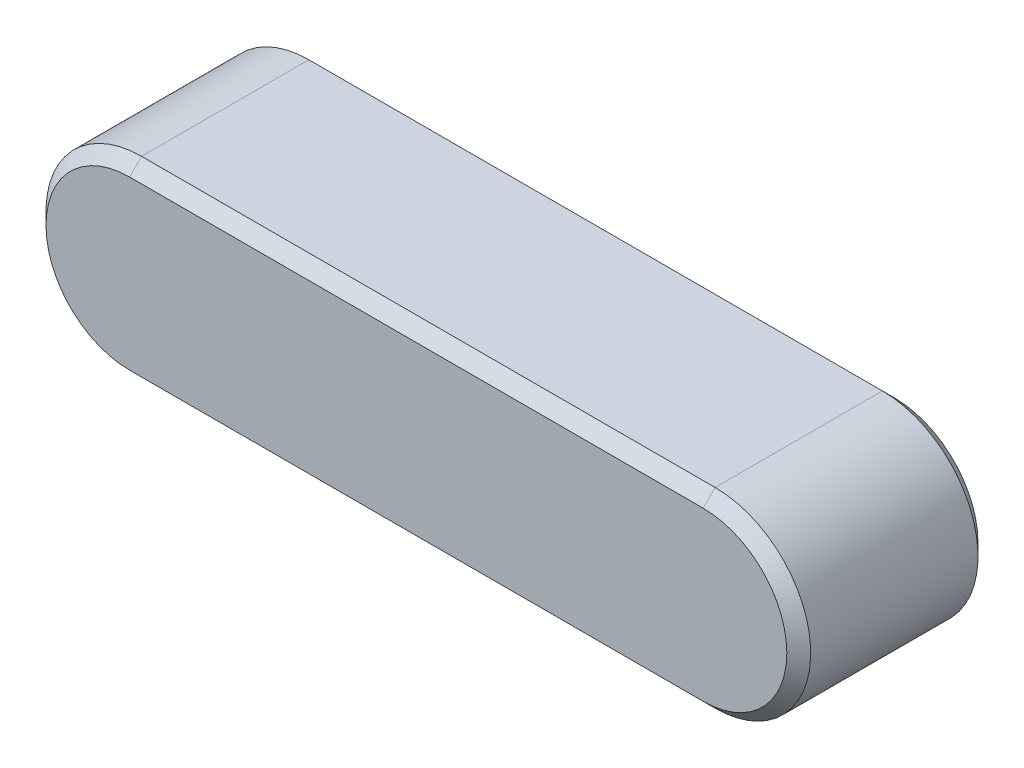
ISO-10303-21;
HEADER;
FILE_DESCRIPTION(('STEP AP214'),'2;1');
FILE_NAME('part.step','',(''),(''),'','','');
FILE_SCHEMA(('AUTOMOTIVE_DESIGN { 1 0 10303 214 1 1 1 1 }'));
ENDSEC;
DATA;
#1=APPLICATION_CONTEXT('core data for automotive mechanical design processes');
#2=APPLICATION_PROTOCOL_DEFINITION('international standard','automotive_design',2000,#1);
#3=PRODUCT_CONTEXT('',#1,'mechanical');
#4=PRODUCT('Part','Part','',(#3));
#5=PRODUCT_RELATED_PRODUCT_CATEGORY('part','',(#4));
#6=PRODUCT_DEFINITION_FORMATION('','',#4);
#7=PRODUCT_DEFINITION_CONTEXT('part definition',#1,'design');
#8=PRODUCT_DEFINITION('design','',#6,#7);
#9=PRODUCT_DEFINITION_SHAPE('','',#8);
#10=(LENGTH_UNIT() NAMED_UNIT(*) SI_UNIT(.MILLI.,.METRE.));
#11=(NAMED_UNIT(*) PLANE_ANGLE_UNIT() SI_UNIT($,.RADIAN.));
#12=(NAMED_UNIT(*) SI_UNIT($,.STERADIAN.) SOLID_ANGLE_UNIT());
#13=UNCERTAINTY_MEASURE_WITH_UNIT(LENGTH_MEASURE(1.E-05),#10,'distance_accuracy_value','');
#14=(GEOMETRIC_REPRESENTATION_CONTEXT(3) GLOBAL_UNCERTAINTY_ASSIGNED_CONTEXT((#13)) GLOBAL_UNIT_ASSIGNED_CONTEXT((#10,
#11,#12)) REPRESENTATION_CONTEXT('',''));
#15=CARTESIAN_POINT('',(0.,0.,0.));
#16=DIRECTION('',(0.,0.,1.));
#17=DIRECTION('',(1.,0.,0.));
#18=AXIS2_PLACEMENT_3D('',#15,#16,#17);
#19=CARTESIAN_POINT('',(-12.,0.,2.));
#20=DIRECTION('',(0.,0.,-1.));
#21=DIRECTION('',(-1.,0.,0.));
#22=AXIS2_PLACEMENT_3D('',#19,#20,#21);
#23=CYLINDRICAL_SURFACE('',#22,2.);
#24=DIRECTION('',(0.,0.,-1.));
#25=VECTOR('',#24,1.);
#26=CARTESIAN_POINT('',(-12.,-2.,2.));
#27=LINE('',#26,#25);
#28=CARTESIAN_POINT('',(-12.,-2.,1.75));
#29=VERTEX_POINT('',#28);
#30=CARTESIAN_POINT('',(-12.,-2.,-1.75));
#31=VERTEX_POINT('',#30);
#32=EDGE_CURVE('E120',#29,#31,#27,.T.);
#33=ORIENTED_EDGE('',*,*,#32,.F.);
#34=CARTESIAN_POINT('',(-12.,0.,1.75));
#35=DIRECTION('',(0.,0.,-1.));
#36=DIRECTION('',(-1.,0.,0.));
#37=AXIS2_PLACEMENT_3D('',#34,#35,#36);
#38=CIRCLE('',#37,2.);
#39=CARTESIAN_POINT('',(-12.,2.,1.75));
#40=VERTEX_POINT('',#39);
#41=EDGE_CURVE('E54',#29,#40,#38,.T.);
#42=ORIENTED_EDGE('',*,*,#41,.T.);
#43=DIRECTION('',(0.,0.,-1.));
#44=VECTOR('',#43,1.);
#45=CARTESIAN_POINT('',(-12.,2.,2.));
#46=LINE('',#45,#44);
#47=CARTESIAN_POINT('',(-12.,2.,-1.75));
#48=VERTEX_POINT('',#47);
#49=EDGE_CURVE('E158',#40,#48,#46,.T.);
#50=ORIENTED_EDGE('',*,*,#49,.T.);
#51=CARTESIAN_POINT('',(-12.,0.,-1.75));
#52=DIRECTION('',(0.,0.,-1.));
#53=DIRECTION('',(-1.,0.,0.));
#54=AXIS2_PLACEMENT_3D('',#51,#52,#53);
#55=CIRCLE('',#54,2.);
#56=EDGE_CURVE('E108',#48,#31,#55,.F.);
#57=ORIENTED_EDGE('',*,*,#56,.T.);
#58=EDGE_LOOP('',(#33,#42,#50,#57));
#59=FACE_BOUND('',#58,.T.);
#60=ADVANCED_FACE('F31',(#59),#23,.T.);
#61=CARTESIAN_POINT('',(0.,-2.,2.));
#62=DIRECTION('',(0.,1.,0.));
#63=DIRECTION('',(-1.,0.,0.));
#64=AXIS2_PLACEMENT_3D('',#61,#62,#63);
#65=PLANE('',#64);
#66=ORIENTED_EDGE('',*,*,#32,.T.);
#67=DIRECTION('',(1.,0.,0.));
#68=VECTOR('',#67,1.);
#69=CARTESIAN_POINT('',(0.,-2.,-1.75));
#70=LINE('',#69,#68);
#71=CARTESIAN_POINT('',(0.,-2.,-1.75));
#72=VERTEX_POINT('',#71);
#73=EDGE_CURVE('E119',#31,#72,#70,.T.);
#74=ORIENTED_EDGE('',*,*,#73,.T.);
#75=DIRECTION('',(0.,0.,-1.));
#76=VECTOR('',#75,1.);
#77=CARTESIAN_POINT('',(0.,-2.,2.));
#78=LINE('',#77,#76);
#79=CARTESIAN_POINT('',(0.,-2.,1.75));
#80=VERTEX_POINT('',#79);
#81=EDGE_CURVE('E102',#80,#72,#78,.T.);
#82=ORIENTED_EDGE('',*,*,#81,.F.);
#83=DIRECTION('',(-1.,0.,0.));
#84=VECTOR('',#83,1.);
#85=CARTESIAN_POINT('',(0.,-2.,1.75));
#86=LINE('',#85,#84);
#87=EDGE_CURVE('E117',#80,#29,#86,.T.);
#88=ORIENTED_EDGE('',*,*,#87,.T.);
#89=EDGE_LOOP('',(#66,#74,#82,#88));
#90=FACE_BOUND('',#89,.T.);
#91=ADVANCED_FACE('F116',(#90),#65,.F.);
#92=CARTESIAN_POINT('',(0.,0.,2.));
#93=DIRECTION('',(0.,0.,-1.));
#94=DIRECTION('',(-1.,0.,0.));
#95=AXIS2_PLACEMENT_3D('',#92,#93,#94);
#96=CYLINDRICAL_SURFACE('',#95,2.);
#97=DIRECTION('',(0.,0.,-1.));
#98=VECTOR('',#97,1.);
#99=CARTESIAN_POINT('',(0.,2.,2.));
#100=LINE('',#99,#98);
#101=CARTESIAN_POINT('',(0.,2.,1.75));
#102=VERTEX_POINT('',#101);
#103=CARTESIAN_POINT('',(0.,2.,-1.75));
#104=VERTEX_POINT('',#103);
#105=EDGE_CURVE('E103',#102,#104,#100,.T.);
#106=ORIENTED_EDGE('',*,*,#105,.F.);
#107=CARTESIAN_POINT('',(0.,0.,1.75));
#108=DIRECTION('',(0.,0.,-1.));
#109=DIRECTION('',(-1.,0.,0.));
#110=AXIS2_PLACEMENT_3D('',#107,#108,#109);
#111=CIRCLE('',#110,2.);
#112=EDGE_CURVE('E99',#102,#80,#111,.T.);
#113=ORIENTED_EDGE('',*,*,#112,.T.);
#114=ORIENTED_EDGE('',*,*,#81,.T.);
#115=CARTESIAN_POINT('',(0.,0.,-1.75));
#116=DIRECTION('',(0.,0.,-1.));
#117=DIRECTION('',(-1.,0.,0.));
#118=AXIS2_PLACEMENT_3D('',#115,#116,#117);
#119=CIRCLE('',#118,2.);
#120=EDGE_CURVE('E109',#72,#104,#119,.F.);
#121=ORIENTED_EDGE('',*,*,#120,.T.);
#122=EDGE_LOOP('',(#106,#113,#114,#121));
#123=FACE_BOUND('',#122,.T.);
#124=ADVANCED_FACE('F101',(#123),#96,.T.);
#125=CARTESIAN_POINT('',(-12.,2.,2.));
#126=DIRECTION('',(0.,-1.,0.));
#127=DIRECTION('',(0.,0.,-1.));
#128=AXIS2_PLACEMENT_3D('',#125,#126,#127);
#129=PLANE('',#128);
#130=ORIENTED_EDGE('',*,*,#49,.F.);
#131=DIRECTION('',(1.,0.,0.));
#132=VECTOR('',#131,1.);
#133=CARTESIAN_POINT('',(-12.,2.,1.75));
#134=LINE('',#133,#132);
#135=EDGE_CURVE('E11',#40,#102,#134,.T.);
#136=ORIENTED_EDGE('',*,*,#135,.T.);
#137=ORIENTED_EDGE('',*,*,#105,.T.);
#138=DIRECTION('',(-1.,0.,0.));
#139=VECTOR('',#138,1.);
#140=CARTESIAN_POINT('',(-12.,2.,-1.75));
#141=LINE('',#140,#139);
#142=EDGE_CURVE('E40',#104,#48,#141,.T.);
#143=ORIENTED_EDGE('',*,*,#142,.T.);
#144=EDGE_LOOP('',(#130,#136,#137,#143));
#145=FACE_BOUND('',#144,.T.);
#146=ADVANCED_FACE('F208',(#145),#129,.F.);
#147=CARTESIAN_POINT('',(-12.,0.,2.));
#148=DIRECTION('',(0.,0.,-1.));
#149=DIRECTION('',(-1.,0.,0.));
#150=AXIS2_PLACEMENT_3D('',#147,#148,#149);
#151=PLANE('',#150);
#152=CARTESIAN_POINT('',(-12.,0.,2.));
#153=DIRECTION('',(0.,0.,-1.));
#154=DIRECTION('',(-1.,0.,0.));
#155=AXIS2_PLACEMENT_3D('',#152,#153,#154);
#156=CIRCLE('',#155,1.75);
#157=CARTESIAN_POINT('',(-12.,1.75,2.));
#158=VERTEX_POINT('',#157);
#159=CARTESIAN_POINT('',(-12.,-1.75,2.));
#160=VERTEX_POINT('',#159);
#161=EDGE_CURVE('E179',#158,#160,#156,.F.);
#162=ORIENTED_EDGE('',*,*,#161,.T.);
#163=DIRECTION('',(1.,0.,0.));
#164=VECTOR('',#163,1.);
#165=CARTESIAN_POINT('',(-12.,-1.75,2.));
#166=LINE('',#165,#164);
#167=CARTESIAN_POINT('',(0.,-1.75,2.));
#168=VERTEX_POINT('',#167);
#169=EDGE_CURVE('E182',#160,#168,#166,.T.);
#170=ORIENTED_EDGE('',*,*,#169,.T.);
#171=CARTESIAN_POINT('',(0.,0.,2.));
#172=DIRECTION('',(0.,0.,-1.));
#173=DIRECTION('',(-1.,0.,0.));
#174=AXIS2_PLACEMENT_3D('',#171,#172,#173);
#175=CIRCLE('',#174,1.75);
#176=CARTESIAN_POINT('',(0.,1.75,2.));
#177=VERTEX_POINT('',#176);
#178=EDGE_CURVE('E131',#168,#177,#175,.F.);
#179=ORIENTED_EDGE('',*,*,#178,.T.);
#180=DIRECTION('',(-1.,0.,0.));
#181=VECTOR('',#180,1.);
#182=CARTESIAN_POINT('',(-12.,1.75,2.));
#183=LINE('',#182,#181);
#184=EDGE_CURVE('E177',#177,#158,#183,.T.);
#185=ORIENTED_EDGE('',*,*,#184,.T.);
#186=EDGE_LOOP('',(#162,#170,#179,#185));
#187=FACE_BOUND('',#186,.T.);
#188=ADVANCED_FACE('F211',(#187),#151,.F.);
#189=CARTESIAN_POINT('',(-12.,0.,-2.));
#190=DIRECTION('',(0.,0.,-1.));
#191=DIRECTION('',(-1.,0.,0.));
#192=AXIS2_PLACEMENT_3D('',#189,#190,#191);
#193=PLANE('',#192);
#194=CARTESIAN_POINT('',(0.,0.,-2.));
#195=DIRECTION('',(0.,0.,-1.));
#196=DIRECTION('',(-1.,0.,0.));
#197=AXIS2_PLACEMENT_3D('',#194,#195,#196);
#198=CIRCLE('',#197,1.75);
#199=CARTESIAN_POINT('',(0.,1.75,-2.));
#200=VERTEX_POINT('',#199);
#201=CARTESIAN_POINT('',(0.,-1.75,-2.));
#202=VERTEX_POINT('',#201);
#203=EDGE_CURVE('E172',#200,#202,#198,.T.);
#204=ORIENTED_EDGE('',*,*,#203,.T.);
#205=DIRECTION('',(-1.,0.,0.));
#206=VECTOR('',#205,1.);
#207=CARTESIAN_POINT('',(-12.,-1.75,-2.));
#208=LINE('',#207,#206);
#209=CARTESIAN_POINT('',(-12.,-1.75,-2.));
#210=VERTEX_POINT('',#209);
#211=EDGE_CURVE('E174',#202,#210,#208,.T.);
#212=ORIENTED_EDGE('',*,*,#211,.T.);
#213=CARTESIAN_POINT('',(-12.,0.,-2.));
#214=DIRECTION('',(0.,0.,-1.));
#215=DIRECTION('',(-1.,0.,0.));
#216=AXIS2_PLACEMENT_3D('',#213,#214,#215);
#217=CIRCLE('',#216,1.75);
#218=CARTESIAN_POINT('',(-12.,1.75,-2.));
#219=VERTEX_POINT('',#218);
#220=EDGE_CURVE('E170',#210,#219,#217,.T.);
#221=ORIENTED_EDGE('',*,*,#220,.T.);
#222=DIRECTION('',(1.,0.,0.));
#223=VECTOR('',#222,1.);
#224=CARTESIAN_POINT('',(0.,1.75,-2.));
#225=LINE('',#224,#223);
#226=EDGE_CURVE('E168',#219,#200,#225,.T.);
#227=ORIENTED_EDGE('',*,*,#226,.T.);
#228=EDGE_LOOP('',(#204,#212,#221,#227));
#229=FACE_BOUND('',#228,.T.);
#230=ADVANCED_FACE('F212',(#229),#193,.T.);
#231=CARTESIAN_POINT('',(-12.,2.,-1.75));
#232=DIRECTION('',(0.,0.707106781186545,-0.70710678118655));
#233=DIRECTION('',(0.,0.70710678118655,0.707106781186545));
#234=AXIS2_PLACEMENT_3D('',#231,#232,#233);
#235=PLANE('',#234);
#236=DIRECTION('',(0.,0.70710678118655,0.707106781186545));
#237=VECTOR('',#236,1.);
#238=CARTESIAN_POINT('',(0.,1.75,-2.));
#239=LINE('',#238,#237);
#240=EDGE_CURVE('E150',#200,#104,#239,.T.);
#241=ORIENTED_EDGE('',*,*,#240,.F.);
#242=ORIENTED_EDGE('',*,*,#226,.F.);
#243=DIRECTION('',(0.,-0.70710678118655,-0.707106781186545));
#244=VECTOR('',#243,1.);
#245=CARTESIAN_POINT('',(-12.,2.,-1.75));
#246=LINE('',#245,#244);
#247=EDGE_CURVE('E137',#48,#219,#246,.T.);
#248=ORIENTED_EDGE('',*,*,#247,.F.);
#249=ORIENTED_EDGE('',*,*,#142,.F.);
#250=EDGE_LOOP('',(#241,#242,#248,#249));
#251=FACE_BOUND('',#250,.T.);
#252=ADVANCED_FACE('F215',(#251),#235,.T.);
#253=CARTESIAN_POINT('',(-12.,0.,-1.75));
#254=DIRECTION('',(0.,0.,1.));
#255=DIRECTION('',(1.,0.,0.));
#256=AXIS2_PLACEMENT_3D('',#253,#254,#255);
#257=CONICAL_SURFACE('',#256,2.,0.785398163397452);
#258=ORIENTED_EDGE('',*,*,#247,.T.);
#259=ORIENTED_EDGE('',*,*,#220,.F.);
#260=DIRECTION('',(0.,0.70710678118655,-0.707106781186545));
#261=VECTOR('',#260,1.);
#262=CARTESIAN_POINT('',(-12.,-2.,-1.75));
#263=LINE('',#262,#261);
#264=EDGE_CURVE('E144',#31,#210,#263,.T.);
#265=ORIENTED_EDGE('',*,*,#264,.F.);
#266=ORIENTED_EDGE('',*,*,#56,.F.);
#267=EDGE_LOOP('',(#258,#259,#265,#266));
#268=FACE_BOUND('',#267,.T.);
#269=ADVANCED_FACE('F187',(#268),#257,.T.);
#270=CARTESIAN_POINT('',(0.,0.,-1.75));
#271=DIRECTION('',(0.,0.,1.));
#272=DIRECTION('',(1.,0.,0.));
#273=AXIS2_PLACEMENT_3D('',#270,#271,#272);
#274=CONICAL_SURFACE('',#273,2.,0.785398163397452);
#275=ORIENTED_EDGE('',*,*,#240,.T.);
#276=ORIENTED_EDGE('',*,*,#120,.F.);
#277=DIRECTION('',(0.,-0.70710678118655,0.707106781186545));
#278=VECTOR('',#277,1.);
#279=CARTESIAN_POINT('',(0.,-1.75,-2.));
#280=LINE('',#279,#278);
#281=EDGE_CURVE('E140',#202,#72,#280,.T.);
#282=ORIENTED_EDGE('',*,*,#281,.F.);
#283=ORIENTED_EDGE('',*,*,#203,.F.);
#284=EDGE_LOOP('',(#275,#276,#282,#283));
#285=FACE_BOUND('',#284,.T.);
#286=ADVANCED_FACE('F190',(#285),#274,.T.);
#287=CARTESIAN_POINT('',(0.,-2.,-1.75));
#288=DIRECTION('',(0.,-0.707106781186545,-0.70710678118655));
#289=DIRECTION('',(0.,0.70710678118655,-0.707106781186545));
#290=AXIS2_PLACEMENT_3D('',#287,#288,#289);
#291=PLANE('',#290);
#292=ORIENTED_EDGE('',*,*,#264,.T.);
#293=ORIENTED_EDGE('',*,*,#211,.F.);
#294=ORIENTED_EDGE('',*,*,#281,.T.);
#295=ORIENTED_EDGE('',*,*,#73,.F.);
#296=EDGE_LOOP('',(#292,#293,#294,#295));
#297=FACE_BOUND('',#296,.T.);
#298=ADVANCED_FACE('F188',(#297),#291,.T.);
#299=CARTESIAN_POINT('',(-12.,1.75,2.));
#300=DIRECTION('',(0.,-0.70710678118655,-0.707106781186545));
#301=DIRECTION('',(0.,0.707106781186545,-0.70710678118655));
#302=AXIS2_PLACEMENT_3D('',#299,#300,#301);
#303=PLANE('',#302);
#304=DIRECTION('',(0.,-0.707106781186545,0.70710678118655));
#305=VECTOR('',#304,1.);
#306=CARTESIAN_POINT('',(0.,2.,1.75));
#307=LINE('',#306,#305);
#308=EDGE_CURVE('E134',#102,#177,#307,.T.);
#309=ORIENTED_EDGE('',*,*,#308,.F.);
#310=ORIENTED_EDGE('',*,*,#135,.F.);
#311=DIRECTION('',(0.,0.707106781186545,-0.70710678118655));
#312=VECTOR('',#311,1.);
#313=CARTESIAN_POINT('',(-12.,1.75,2.));
#314=LINE('',#313,#312);
#315=EDGE_CURVE('E35',#158,#40,#314,.T.);
#316=ORIENTED_EDGE('',*,*,#315,.F.);
#317=ORIENTED_EDGE('',*,*,#184,.F.);
#318=EDGE_LOOP('',(#309,#310,#316,#317));
#319=FACE_BOUND('',#318,.T.);
#320=ADVANCED_FACE('F33',(#319),#303,.F.);
#321=CARTESIAN_POINT('',(-12.,0.,2.));
#322=DIRECTION('',(0.,0.,-1.));
#323=DIRECTION('',(-1.,0.,0.));
#324=AXIS2_PLACEMENT_3D('',#321,#322,#323);
#325=CONICAL_SURFACE('',#324,1.75,0.785398163397445);
#326=ORIENTED_EDGE('',*,*,#315,.T.);
#327=ORIENTED_EDGE('',*,*,#41,.F.);
#328=DIRECTION('',(0.,-0.707106781186545,-0.70710678118655));
#329=VECTOR('',#328,1.);
#330=CARTESIAN_POINT('',(-12.,-1.75,2.));
#331=LINE('',#330,#329);
#332=EDGE_CURVE('E128',#160,#29,#331,.T.);
#333=ORIENTED_EDGE('',*,*,#332,.F.);
#334=ORIENTED_EDGE('',*,*,#161,.F.);
#335=EDGE_LOOP('',(#326,#327,#333,#334));
#336=FACE_BOUND('',#335,.T.);
#337=ADVANCED_FACE('F196',(#336),#325,.T.);
#338=CARTESIAN_POINT('',(0.,0.,2.));
#339=DIRECTION('',(0.,0.,-1.));
#340=DIRECTION('',(-1.,0.,0.));
#341=AXIS2_PLACEMENT_3D('',#338,#339,#340);
#342=CONICAL_SURFACE('',#341,1.75,0.785398163397445);
#343=ORIENTED_EDGE('',*,*,#308,.T.);
#344=ORIENTED_EDGE('',*,*,#178,.F.);
#345=DIRECTION('',(0.,0.707106781186545,0.70710678118655));
#346=VECTOR('',#345,1.);
#347=CARTESIAN_POINT('',(0.,-2.,1.75));
#348=LINE('',#347,#346);
#349=EDGE_CURVE('E125',#80,#168,#348,.T.);
#350=ORIENTED_EDGE('',*,*,#349,.F.);
#351=ORIENTED_EDGE('',*,*,#112,.F.);
#352=EDGE_LOOP('',(#343,#344,#350,#351));
#353=FACE_BOUND('',#352,.T.);
#354=ADVANCED_FACE('F130',(#353),#342,.T.);
#355=CARTESIAN_POINT('',(-12.,-1.75,2.));
#356=DIRECTION('',(0.,0.707106781186547,-0.707106781186547));
#357=DIRECTION('',(0.,0.707106781186548,0.707106781186548));
#358=AXIS2_PLACEMENT_3D('',#355,#356,#357);
#359=PLANE('',#358);
#360=ORIENTED_EDGE('',*,*,#332,.T.);
#361=ORIENTED_EDGE('',*,*,#87,.F.);
#362=ORIENTED_EDGE('',*,*,#349,.T.);
#363=ORIENTED_EDGE('',*,*,#169,.F.);
#364=EDGE_LOOP('',(#360,#361,#362,#363));
#365=FACE_BOUND('',#364,.T.);
#366=ADVANCED_FACE('F123',(#365),#359,.F.);
#367=CLOSED_SHELL('',(#60,#91,#124,#146,#188,#230,#252,#269,#286,#298,#320,#337,#354,#366));
#368=MANIFOLD_SOLID_BREP('B2',#367);
#369=ADVANCED_BREP_SHAPE_REPRESENTATION('',(#18,#368),#14);
#370=SHAPE_DEFINITION_REPRESENTATION(#9,#369);
ENDSEC;
END-ISO-10303-21;
